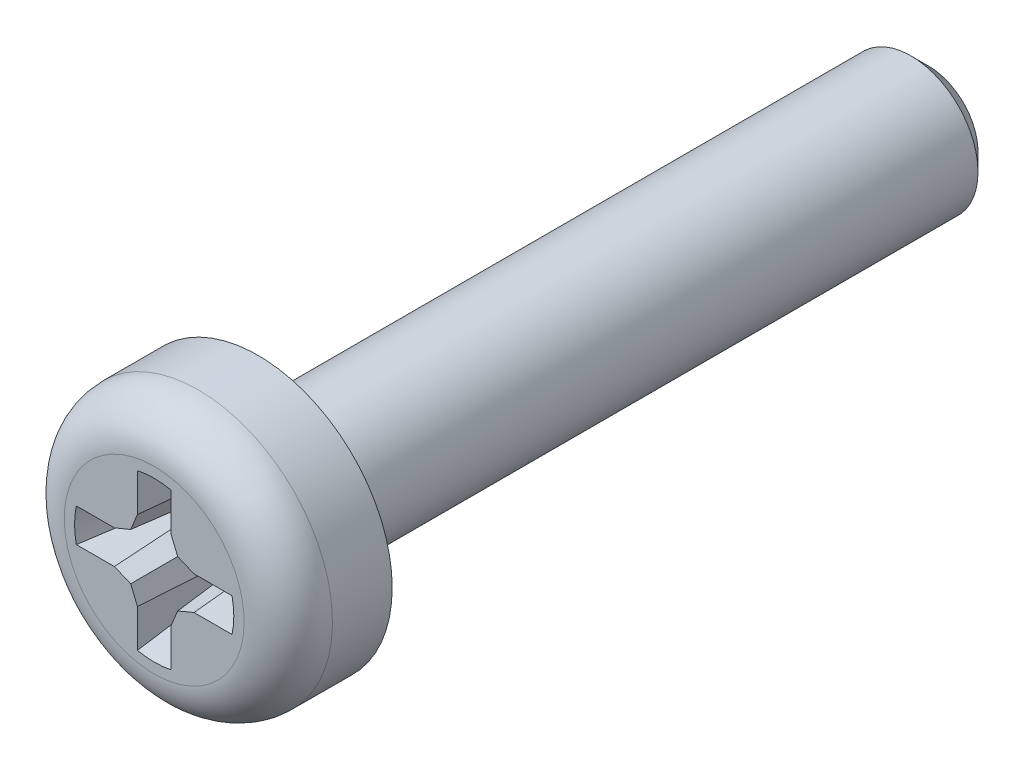
ISO-10303-21;
HEADER;
FILE_DESCRIPTION(('STEP AP214'),'2;1');
FILE_NAME('part.step','',(''),(''),'','','');
FILE_SCHEMA(('AUTOMOTIVE_DESIGN { 1 0 10303 214 1 1 1 1 }'));
ENDSEC;
DATA;
#1=APPLICATION_CONTEXT('core data for automotive mechanical design processes');
#2=APPLICATION_PROTOCOL_DEFINITION('international standard','automotive_design',2000,#1);
#3=PRODUCT_CONTEXT('',#1,'mechanical');
#4=PRODUCT('Part','Part','',(#3));
#5=PRODUCT_RELATED_PRODUCT_CATEGORY('part','',(#4));
#6=PRODUCT_DEFINITION_FORMATION('','',#4);
#7=PRODUCT_DEFINITION_CONTEXT('part definition',#1,'design');
#8=PRODUCT_DEFINITION('design','',#6,#7);
#9=PRODUCT_DEFINITION_SHAPE('','',#8);
#10=(LENGTH_UNIT() NAMED_UNIT(*) SI_UNIT(.MILLI.,.METRE.));
#11=(NAMED_UNIT(*) PLANE_ANGLE_UNIT() SI_UNIT($,.RADIAN.));
#12=(NAMED_UNIT(*) SI_UNIT($,.STERADIAN.) SOLID_ANGLE_UNIT());
#13=UNCERTAINTY_MEASURE_WITH_UNIT(LENGTH_MEASURE(1.E-05),#10,'distance_accuracy_value','');
#14=(GEOMETRIC_REPRESENTATION_CONTEXT(3) GLOBAL_UNCERTAINTY_ASSIGNED_CONTEXT((#13)) GLOBAL_UNIT_ASSIGNED_CONTEXT((#10,
#11,#12)) REPRESENTATION_CONTEXT('',''));
#15=CARTESIAN_POINT('',(0.,0.,0.));
#16=DIRECTION('',(0.,0.,1.));
#17=DIRECTION('',(1.,0.,0.));
#18=AXIS2_PLACEMENT_3D('',#15,#16,#17);
#19=CARTESIAN_POINT('',(0.,0.,0.));
#20=DIRECTION('',(0.,0.,1.));
#21=DIRECTION('',(1.,0.,0.));
#22=AXIS2_PLACEMENT_3D('',#19,#20,#21);
#23=PLANE('',#22);
#24=CARTESIAN_POINT('',(0.,0.,0.));
#25=DIRECTION('',(0.,0.,1.));
#26=DIRECTION('',(1.,0.,0.));
#27=AXIS2_PLACEMENT_3D('',#24,#25,#26);
#28=CIRCLE('',#27,4.);
#29=CARTESIAN_POINT('',(-4.,0.,0.));
#30=VERTEX_POINT('',#29);
#31=EDGE_CURVE('E56',#30,#30,#28,.T.);
#32=ORIENTED_EDGE('',*,*,#31,.F.);
#33=EDGE_LOOP('',(#32));
#34=FACE_BOUND('',#33,.T.);
#35=CARTESIAN_POINT('',(0.,0.,0.));
#36=DIRECTION('',(0.,0.,1.));
#37=DIRECTION('',(1.,0.,0.));
#38=AXIS2_PLACEMENT_3D('',#35,#36,#37);
#39=CIRCLE('',#38,2.);
#40=CARTESIAN_POINT('',(2.,0.,0.));
#41=VERTEX_POINT('',#40);
#42=EDGE_CURVE('E11',#41,#41,#39,.F.);
#43=ORIENTED_EDGE('',*,*,#42,.F.);
#44=EDGE_LOOP('',(#43));
#45=FACE_BOUND('',#44,.T.);
#46=ADVANCED_FACE('F39',(#34,#45),#23,.F.);
#47=CARTESIAN_POINT('',(0.,0.,3.1));
#48=DIRECTION('',(0.,0.,-1.));
#49=DIRECTION('',(-1.,0.,0.));
#50=AXIS2_PLACEMENT_3D('',#47,#48,#49);
#51=CYLINDRICAL_SURFACE('',#50,4.);
#52=CARTESIAN_POINT('',(0.,0.,1.7825));
#53=DIRECTION('',(0.,0.,-1.));
#54=DIRECTION('',(0.,1.,0.));
#55=AXIS2_PLACEMENT_3D('',#52,#53,#54);
#56=CIRCLE('',#55,4.);
#57=CARTESIAN_POINT('',(-4.,0.,1.7825));
#58=VERTEX_POINT('',#57);
#59=EDGE_CURVE('E456',#58,#58,#56,.T.);
#60=CARTESIAN_POINT('',(-4.,0.,1.7825));
#61=CARTESIAN_POINT('',(-4.,0.,1.76393229166667));
#62=CARTESIAN_POINT('',(-4.,0.,1.74536458333333));
#63=CARTESIAN_POINT('',(-4.,0.,1.70822916666667));
#64=CARTESIAN_POINT('',(-4.,0.,1.68966145833333));
#65=CARTESIAN_POINT('',(-4.,0.,1.65252604166667));
#66=CARTESIAN_POINT('',(-4.,0.,1.63395833333333));
#67=CARTESIAN_POINT('',(-4.,0.,1.59682291666667));
#68=CARTESIAN_POINT('',(-4.,0.,1.57825520833333));
#69=CARTESIAN_POINT('',(-4.,0.,1.54111979166667));
#70=CARTESIAN_POINT('',(-4.,0.,1.52255208333333));
#71=CARTESIAN_POINT('',(-4.,0.,1.48541666666667));
#72=CARTESIAN_POINT('',(-4.,0.,1.46684895833333));
#73=CARTESIAN_POINT('',(-4.,0.,1.42971354166667));
#74=CARTESIAN_POINT('',(-4.,0.,1.41114583333333));
#75=CARTESIAN_POINT('',(-4.,0.,1.37401041666667));
#76=CARTESIAN_POINT('',(-4.,0.,1.35544270833333));
#77=CARTESIAN_POINT('',(-4.,0.,1.31830729166667));
#78=CARTESIAN_POINT('',(-4.,0.,1.29973958333333));
#79=CARTESIAN_POINT('',(-4.,0.,1.26260416666667));
#80=CARTESIAN_POINT('',(-4.,0.,1.24403645833333));
#81=CARTESIAN_POINT('',(-4.,0.,1.20690104166667));
#82=CARTESIAN_POINT('',(-4.,0.,1.18833333333333));
#83=CARTESIAN_POINT('',(-4.,0.,1.15119791666667));
#84=CARTESIAN_POINT('',(-4.,0.,1.13263020833333));
#85=CARTESIAN_POINT('',(-4.,0.,1.09549479166667));
#86=CARTESIAN_POINT('',(-4.,0.,1.07692708333333));
#87=CARTESIAN_POINT('',(-4.,0.,1.03979166666667));
#88=CARTESIAN_POINT('',(-4.,0.,1.02122395833333));
#89=CARTESIAN_POINT('',(-4.,0.,0.984088541666667));
#90=CARTESIAN_POINT('',(-4.,0.,0.965520833333333));
#91=CARTESIAN_POINT('',(-4.,0.,0.928385416666666));
#92=CARTESIAN_POINT('',(-4.,0.,0.909817708333333));
#93=CARTESIAN_POINT('',(-4.,0.,0.872682291666666));
#94=CARTESIAN_POINT('',(-4.,0.,0.854114583333333));
#95=CARTESIAN_POINT('',(-4.,0.,0.816979166666667));
#96=CARTESIAN_POINT('',(-4.,0.,0.798411458333333));
#97=CARTESIAN_POINT('',(-4.,0.,0.761276041666667));
#98=CARTESIAN_POINT('',(-4.,0.,0.742708333333333));
#99=CARTESIAN_POINT('',(-4.,0.,0.705572916666667));
#100=CARTESIAN_POINT('',(-4.,0.,0.687005208333333));
#101=CARTESIAN_POINT('',(-4.,0.,0.649869791666667));
#102=CARTESIAN_POINT('',(-4.,0.,0.631302083333333));
#103=CARTESIAN_POINT('',(-4.,0.,0.594166666666667));
#104=CARTESIAN_POINT('',(-4.,0.,0.575598958333333));
#105=CARTESIAN_POINT('',(-4.,0.,0.538463541666667));
#106=CARTESIAN_POINT('',(-4.,0.,0.519895833333333));
#107=CARTESIAN_POINT('',(-4.,0.,0.482760416666667));
#108=CARTESIAN_POINT('',(-4.,0.,0.464192708333333));
#109=CARTESIAN_POINT('',(-4.,0.,0.427057291666667));
#110=CARTESIAN_POINT('',(-4.,0.,0.408489583333333));
#111=CARTESIAN_POINT('',(-4.,0.,0.371354166666667));
#112=CARTESIAN_POINT('',(-4.,0.,0.352786458333333));
#113=CARTESIAN_POINT('',(-4.,0.,0.315651041666667));
#114=CARTESIAN_POINT('',(-4.,0.,0.297083333333333));
#115=CARTESIAN_POINT('',(-4.,0.,0.259947916666666));
#116=CARTESIAN_POINT('',(-4.,0.,0.241380208333333));
#117=CARTESIAN_POINT('',(-4.,0.,0.204244791666667));
#118=CARTESIAN_POINT('',(-4.,0.,0.185677083333333));
#119=CARTESIAN_POINT('',(-4.,0.,0.148541666666667));
#120=CARTESIAN_POINT('',(-4.,0.,0.129973958333333));
#121=CARTESIAN_POINT('',(-4.,0.,0.0928385416666666));
#122=CARTESIAN_POINT('',(-4.,0.,0.0742708333333332));
#123=CARTESIAN_POINT('',(-4.,0.,0.0371354166666665));
#124=CARTESIAN_POINT('',(-4.,0.,0.0185677083333332));
#125=CARTESIAN_POINT('',(-4.,0.,0.));
#126=B_SPLINE_CURVE_WITH_KNOTS('',3,(#60,#61,#62,#63,#64,#65,#66,#67,#68,#69,#70,#71,#72,#73,
#74,#75,#76,#77,#78,#79,#80,#81,#82,#83,#84,#85,#86,#87,#88,#89,#90,#91,#92,#93,#94,#95,#96,#97,
#98,#99,#100,#101,#102,#103,#104,#105,#106,#107,#108,#109,#110,#111,#112,#113,#114,#115,#116,
#117,#118,#119,#120,#121,#122,#123,#124,#125),.UNSPECIFIED.,.F.,.F.,(4,2,2,2,2,2,2,2,2,2,2,2,2,
2,2,2,2,2,2,2,2,2,2,2,2,2,2,2,2,2,2,2,4),(0.,0.055703125,0.11140625,0.167109375,0.2228125,
0.278515625,0.33421875,0.389921875,0.445625,0.501328125,0.55703125,0.612734375,0.6684375,
0.724140625,0.77984375,0.835546875,0.89125,0.946953125,1.00265625,1.058359375,1.1140625,
1.169765625,1.22546875,1.281171875,1.336875,1.392578125,1.44828125,1.503984375,1.5596875,
1.615390625,1.67109375,1.726796875,1.7825),.UNSPECIFIED.);
#127=EDGE_CURVE('BSEAM382',#58,#30,#126,.T.);
#128=ORIENTED_EDGE('',*,*,#59,.T.);
#129=ORIENTED_EDGE('',*,*,#31,.T.);
#130=ORIENTED_EDGE('',*,*,#127,.T.);
#131=ORIENTED_EDGE('',*,*,#127,.F.);
#132=EDGE_LOOP('',(#128,#130,#129,#131));
#133=FACE_BOUND('',#132,.T.);
#134=ADVANCED_FACE('F382',(#133),#51,.T.);
#135=CARTESIAN_POINT('',(0.,0.,1.7825));
#136=DIRECTION('',(0.,0.,-1.));
#137=DIRECTION('',(0.,1.,0.));
#138=AXIS2_PLACEMENT_3D('',#135,#136,#137);
#139=TOROIDAL_SURFACE('',#138,2.6825,1.3175);
#140=ORIENTED_EDGE('',*,*,#59,.F.);
#141=EDGE_LOOP('',(#140));
#142=FACE_BOUND('',#141,.T.);
#143=CARTESIAN_POINT('',(0.,0.,3.1));
#144=DIRECTION('',(0.,0.,-1.));
#145=DIRECTION('',(0.,1.,0.));
#146=AXIS2_PLACEMENT_3D('',#143,#144,#145);
#147=CIRCLE('',#146,2.6825);
#148=CARTESIAN_POINT('',(0.,2.6825,3.1));
#149=VERTEX_POINT('',#148);
#150=EDGE_CURVE('E452',#149,#149,#147,.T.);
#151=ORIENTED_EDGE('',*,*,#150,.T.);
#152=EDGE_LOOP('',(#151));
#153=FACE_BOUND('',#152,.T.);
#154=ADVANCED_FACE('F388',(#142,#153),#139,.T.);
#155=CARTESIAN_POINT('',(0.,0.,3.1));
#156=DIRECTION('',(0.,0.,1.));
#157=DIRECTION('',(1.,0.,0.));
#158=AXIS2_PLACEMENT_3D('',#155,#156,#157);
#159=PLANE('',#158);
#160=DIRECTION('',(0.,-1.,0.));
#161=VECTOR('',#160,1.);
#162=CARTESIAN_POINT('',(-0.500000000000005,1.1875,3.1));
#163=LINE('',#162,#161);
#164=CARTESIAN_POINT('',(-0.500000000000009,2.32177195262584,3.1));
#165=VERTEX_POINT('',#164);
#166=CARTESIAN_POINT('',(-0.500000000000005,1.1875,3.1));
#167=VERTEX_POINT('',#166);
#168=EDGE_CURVE('E337',#165,#167,#163,.T.);
#169=ORIENTED_EDGE('',*,*,#168,.F.);
#170=CARTESIAN_POINT('',(0.,0.,3.1));
#171=DIRECTION('',(0.,0.,1.));
#172=DIRECTION('',(1.,0.,0.));
#173=AXIS2_PLACEMENT_3D('',#170,#171,#172);
#174=CIRCLE('',#173,2.375);
#175=CARTESIAN_POINT('',(0.5,2.32177195262584,3.1));
#176=VERTEX_POINT('',#175);
#177=EDGE_CURVE('E344',#176,#165,#174,.T.);
#178=ORIENTED_EDGE('',*,*,#177,.F.);
#179=DIRECTION('',(0.,1.,0.));
#180=VECTOR('',#179,1.);
#181=CARTESIAN_POINT('',(0.5,2.32177195262584,3.1));
#182=LINE('',#181,#180);
#183=CARTESIAN_POINT('',(0.5,1.1875,3.1));
#184=VERTEX_POINT('',#183);
#185=EDGE_CURVE('E440',#184,#176,#182,.T.);
#186=ORIENTED_EDGE('',*,*,#185,.F.);
#187=DIRECTION('',(-0.382683432365083,0.923879532511289,0.));
#188=VECTOR('',#187,1.);
#189=CARTESIAN_POINT('',(0.5,1.1875,3.1));
#190=LINE('',#189,#188);
#191=CARTESIAN_POINT('',(0.701364087934246,0.701364087934246,3.1));
#192=VERTEX_POINT('',#191);
#193=EDGE_CURVE('E434',#192,#184,#190,.T.);
#194=ORIENTED_EDGE('',*,*,#193,.F.);
#195=DIRECTION('',(-0.92387953251129,0.382683432365083,0.));
#196=VECTOR('',#195,1.);
#197=CARTESIAN_POINT('',(1.1875,0.500000000000001,3.1));
#198=LINE('',#197,#196);
#199=CARTESIAN_POINT('',(1.1875,0.500000000000001,3.1));
#200=VERTEX_POINT('',#199);
#201=EDGE_CURVE('E193',#200,#192,#198,.T.);
#202=ORIENTED_EDGE('',*,*,#201,.F.);
#203=DIRECTION('',(-1.,0.,0.));
#204=VECTOR('',#203,1.);
#205=CARTESIAN_POINT('',(1.1875,0.500000000000001,3.1));
#206=LINE('',#205,#204);
#207=CARTESIAN_POINT('',(2.32177195262584,0.500000000000001,3.1));
#208=VERTEX_POINT('',#207);
#209=EDGE_CURVE('E426',#208,#200,#206,.T.);
#210=ORIENTED_EDGE('',*,*,#209,.F.);
#211=CARTESIAN_POINT('',(0.,0.,3.1));
#212=DIRECTION('',(0.,0.,1.));
#213=DIRECTION('',(1.,0.,0.));
#214=AXIS2_PLACEMENT_3D('',#211,#212,#213);
#215=CIRCLE('',#214,2.375);
#216=CARTESIAN_POINT('',(2.32177195262584,-0.499999999999976,3.1));
#217=VERTEX_POINT('',#216);
#218=EDGE_CURVE('E290',#217,#208,#215,.T.);
#219=ORIENTED_EDGE('',*,*,#218,.F.);
#220=DIRECTION('',(1.,0.,0.));
#221=VECTOR('',#220,1.);
#222=CARTESIAN_POINT('',(2.32177195262584,-0.499999999999976,3.1));
#223=LINE('',#222,#221);
#224=CARTESIAN_POINT('',(1.1875,-0.499999999999988,3.1));
#225=VERTEX_POINT('',#224);
#226=EDGE_CURVE('E519',#225,#217,#223,.T.);
#227=ORIENTED_EDGE('',*,*,#226,.F.);
#228=DIRECTION('',(0.923879532511285,0.382683432365093,0.));
#229=VECTOR('',#228,1.);
#230=CARTESIAN_POINT('',(1.1875,-0.499999999999988,3.1));
#231=LINE('',#230,#229);
#232=CARTESIAN_POINT('',(0.701364087934254,-0.701364087934238,3.1));
#233=VERTEX_POINT('',#232);
#234=EDGE_CURVE('E522',#233,#225,#231,.T.);
#235=ORIENTED_EDGE('',*,*,#234,.F.);
#236=DIRECTION('',(0.382683432365073,0.923879532511294,0.));
#237=VECTOR('',#236,1.);
#238=CARTESIAN_POINT('',(0.500000000000013,-1.18749999999999,3.1));
#239=LINE('',#238,#237);
#240=CARTESIAN_POINT('',(0.500000000000013,-1.18749999999999,3.1));
#241=VERTEX_POINT('',#240);
#242=EDGE_CURVE('E525',#241,#233,#239,.T.);
#243=ORIENTED_EDGE('',*,*,#242,.F.);
#244=DIRECTION('',(0.,1.,0.));
#245=VECTOR('',#244,1.);
#246=CARTESIAN_POINT('',(0.500000000000013,-1.18749999999999,3.1));
#247=LINE('',#246,#245);
#248=CARTESIAN_POINT('',(0.500000000000025,-2.32177195262583,3.1));
#249=VERTEX_POINT('',#248);
#250=EDGE_CURVE('E528',#249,#241,#247,.T.);
#251=ORIENTED_EDGE('',*,*,#250,.F.);
#252=CARTESIAN_POINT('',(0.,0.,3.1));
#253=DIRECTION('',(0.,0.,1.));
#254=DIRECTION('',(-1.,0.,0.));
#255=AXIS2_PLACEMENT_3D('',#252,#253,#254);
#256=CIRCLE('',#255,2.375);
#257=CARTESIAN_POINT('',(-0.499999999999984,-2.32177195262584,3.1));
#258=VERTEX_POINT('',#257);
#259=EDGE_CURVE('E499',#258,#249,#256,.T.);
#260=ORIENTED_EDGE('',*,*,#259,.F.);
#261=DIRECTION('',(0.,-1.,0.));
#262=VECTOR('',#261,1.);
#263=CARTESIAN_POINT('',(-0.499999999999984,-2.32177195262584,3.1));
#264=LINE('',#263,#262);
#265=CARTESIAN_POINT('',(-0.499999999999992,-1.1875,3.1));
#266=VERTEX_POINT('',#265);
#267=EDGE_CURVE('E503',#266,#258,#264,.T.);
#268=ORIENTED_EDGE('',*,*,#267,.F.);
#269=DIRECTION('',(0.382683432365089,-0.923879532511287,0.));
#270=VECTOR('',#269,1.);
#271=CARTESIAN_POINT('',(-0.499999999999992,-1.1875,3.1));
#272=LINE('',#271,#270);
#273=CARTESIAN_POINT('',(-0.701364087934241,-0.701364087934251,3.1));
#274=VERTEX_POINT('',#273);
#275=EDGE_CURVE('E507',#274,#266,#272,.T.);
#276=ORIENTED_EDGE('',*,*,#275,.F.);
#277=DIRECTION('',(0.923879532511292,-0.382683432365076,0.));
#278=VECTOR('',#277,1.);
#279=CARTESIAN_POINT('',(-1.1875,-0.500000000000009,3.1));
#280=LINE('',#279,#278);
#281=CARTESIAN_POINT('',(-1.1875,-0.500000000000009,3.1));
#282=VERTEX_POINT('',#281);
#283=EDGE_CURVE('E511',#282,#274,#280,.T.);
#284=ORIENTED_EDGE('',*,*,#283,.F.);
#285=DIRECTION('',(1.,0.,0.));
#286=VECTOR('',#285,1.);
#287=CARTESIAN_POINT('',(-1.1875,-0.500000000000009,3.1));
#288=LINE('',#287,#286);
#289=CARTESIAN_POINT('',(-2.32177195262584,-0.500000000000017,3.1));
#290=VERTEX_POINT('',#289);
#291=EDGE_CURVE('E515',#290,#282,#288,.T.);
#292=ORIENTED_EDGE('',*,*,#291,.F.);
#293=CARTESIAN_POINT('',(0.,0.,3.1));
#294=DIRECTION('',(0.,0.,1.));
#295=DIRECTION('',(0.,1.,0.));
#296=AXIS2_PLACEMENT_3D('',#293,#294,#295);
#297=CIRCLE('',#296,2.375);
#298=CARTESIAN_POINT('',(-2.32177195262584,0.499999999999992,3.1));
#299=VERTEX_POINT('',#298);
#300=EDGE_CURVE('E138',#299,#290,#297,.T.);
#301=ORIENTED_EDGE('',*,*,#300,.F.);
#302=DIRECTION('',(-1.,0.,0.));
#303=VECTOR('',#302,1.);
#304=CARTESIAN_POINT('',(-2.32177195262584,0.499999999999992,3.1));
#305=LINE('',#304,#303);
#306=CARTESIAN_POINT('',(-1.1875,0.499999999999996,3.1));
#307=VERTEX_POINT('',#306);
#308=EDGE_CURVE('E484',#307,#299,#305,.T.);
#309=ORIENTED_EDGE('',*,*,#308,.F.);
#310=DIRECTION('',(-0.923879532511288,-0.382683432365086,0.));
#311=VECTOR('',#310,1.);
#312=CARTESIAN_POINT('',(-1.1875,0.499999999999996,3.1));
#313=LINE('',#312,#311);
#314=CARTESIAN_POINT('',(-0.701364087934249,0.701364087934243,3.1));
#315=VERTEX_POINT('',#314);
#316=EDGE_CURVE('E487',#315,#307,#313,.T.);
#317=ORIENTED_EDGE('',*,*,#316,.F.);
#318=DIRECTION('',(-0.38268343236508,-0.923879532511291,0.));
#319=VECTOR('',#318,1.);
#320=CARTESIAN_POINT('',(-0.500000000000005,1.1875,3.1));
#321=LINE('',#320,#319);
#322=EDGE_CURVE('E493',#167,#315,#321,.T.);
#323=ORIENTED_EDGE('',*,*,#322,.F.);
#324=EDGE_LOOP('',(#169,#178,#186,#194,#202,#210,#219,#227,#235,#243,#251,#260,#268,#276,#284,
#292,#301,#309,#317,#323));
#325=FACE_BOUND('',#324,.T.);
#326=ORIENTED_EDGE('',*,*,#150,.F.);
#327=EDGE_LOOP('',(#326));
#328=FACE_BOUND('',#327,.T.);
#329=ADVANCED_FACE('F393',(#325,#328),#159,.T.);
#330=CARTESIAN_POINT('',(0.,0.,-20.));
#331=DIRECTION('',(0.,0.,1.));
#332=DIRECTION('',(1.,0.,0.));
#333=AXIS2_PLACEMENT_3D('',#330,#331,#332);
#334=PLANE('',#333);
#335=CARTESIAN_POINT('',(0.,0.,-20.));
#336=DIRECTION('',(0.,0.,1.));
#337=DIRECTION('',(1.,0.,0.));
#338=AXIS2_PLACEMENT_3D('',#335,#336,#337);
#339=CIRCLE('',#338,1.475);
#340=CARTESIAN_POINT('',(1.475,0.,-20.));
#341=VERTEX_POINT('',#340);
#342=EDGE_CURVE('E448',#341,#341,#339,.F.);
#343=ORIENTED_EDGE('',*,*,#342,.T.);
#344=EDGE_LOOP('',(#343));
#345=FACE_BOUND('',#344,.T.);
#346=ADVANCED_FACE('F396',(#345),#334,.F.);
#347=CARTESIAN_POINT('',(0.,0.,0.));
#348=DIRECTION('',(0.,0.,1.));
#349=DIRECTION('',(1.,0.,0.));
#350=AXIS2_PLACEMENT_3D('',#347,#348,#349);
#351=CYLINDRICAL_SURFACE('',#350,2.);
#352=CARTESIAN_POINT('',(0.,0.,-19.475));
#353=DIRECTION('',(0.,0.,1.));
#354=DIRECTION('',(1.,0.,0.));
#355=AXIS2_PLACEMENT_3D('',#352,#353,#354);
#356=CIRCLE('',#355,2.);
#357=CARTESIAN_POINT('',(2.,0.,-19.475));
#358=VERTEX_POINT('',#357);
#359=EDGE_CURVE('E229',#358,#358,#356,.T.);
#360=ORIENTED_EDGE('',*,*,#359,.T.);
#361=EDGE_LOOP('',(#360));
#362=FACE_BOUND('',#361,.T.);
#363=ORIENTED_EDGE('',*,*,#42,.T.);
#364=EDGE_LOOP('',(#363));
#365=FACE_BOUND('',#364,.T.);
#366=ADVANCED_FACE('F403',(#362,#365),#351,.T.);
#367=CARTESIAN_POINT('',(0.,0.,-19.475));
#368=DIRECTION('',(0.,0.,1.));
#369=DIRECTION('',(1.,0.,0.));
#370=AXIS2_PLACEMENT_3D('',#367,#368,#369);
#371=CONICAL_SURFACE('',#370,2.,0.785398163397454);
#372=ORIENTED_EDGE('',*,*,#342,.F.);
#373=EDGE_LOOP('',(#372));
#374=FACE_BOUND('',#373,.T.);
#375=ORIENTED_EDGE('',*,*,#359,.F.);
#376=EDGE_LOOP('',(#375));
#377=FACE_BOUND('',#376,.T.);
#378=ADVANCED_FACE('F238',(#374,#377),#371,.T.);
#379=CARTESIAN_POINT('',(0.,0.,3.1));
#380=DIRECTION('',(0.,0.,1.));
#381=DIRECTION('',(1.,0.,0.));
#382=AXIS2_PLACEMENT_3D('',#379,#380,#381);
#383=CONICAL_SURFACE('',#382,2.375,0.26179938779915);
#384=ORIENTED_EDGE('',*,*,#177,.T.);
#385=CARTESIAN_POINT('',(-0.500000000000009,2.32177195262584,3.1));
#386=CARTESIAN_POINT('',(-0.47343930678139,2.24427703480566,2.79640988731358));
#387=CARTESIAN_POINT('',(-0.446879730252152,2.16673165946756,2.49283253844521));
#388=CARTESIAN_POINT('',(-0.393764081079549,2.01148388565445,1.88571789030724));
#389=CARTESIAN_POINT('',(-0.367208008434063,1.93378148727489,1.58218059101342));
#390=CARTESIAN_POINT('',(-0.314100594056121,1.77816343242277,0.975160067009124));
#391=CARTESIAN_POINT('',(-0.287549252325663,1.70024777586032,0.671676842321505));
#392=CARTESIAN_POINT('',(-0.234454103493325,1.54407853183752,0.0647965141449838));
#393=CARTESIAN_POINT('',(-0.207910296396182,1.46582494416517,-0.238600589289766));
#394=CARTESIAN_POINT('',(-0.181371669535779,1.38734008699268,-0.541938482347625));
#395=B_SPLINE_CURVE_WITH_KNOTS('',3,(#385,#386,#387,#388,#389,#390,#391,#392,#393,#394),
.UNSPECIFIED.,.F.,.F.,(4,2,2,2,4),(0.,0.943345660311494,1.88669074731104,2.83003623194303,
3.77338230842007),.UNSPECIFIED.);
#396=CARTESIAN_POINT('',(-0.269467371609197,1.64705627783094,0.465));
#397=VERTEX_POINT('',#396);
#398=EDGE_CURVE('E247',#397,#165,#395,.F.);
#399=ORIENTED_EDGE('',*,*,#398,.F.);
#400=CARTESIAN_POINT('',(0.,0.,0.465));
#401=DIRECTION('',(0.,0.,1.));
#402=DIRECTION('',(1.,0.,0.));
#403=AXIS2_PLACEMENT_3D('',#400,#401,#402);
#404=CIRCLE('',#403,1.66895387794399);
#405=CARTESIAN_POINT('',(0.26946737160919,1.64705627783094,0.465));
#406=VERTEX_POINT('',#405);
#407=EDGE_CURVE('E220',#406,#397,#404,.T.);
#408=ORIENTED_EDGE('',*,*,#407,.F.);
#409=CARTESIAN_POINT('',(0.26946737160919,1.64705627783094,0.465));
#410=CARTESIAN_POINT('',(0.28867325225766,1.70351500535314,0.684524220332607));
#411=CARTESIAN_POINT('',(0.307880871567887,1.75989578614274,0.904068313660021));
#412=CARTESIAN_POINT('',(0.346298880089182,1.8725328045999,1.34318816042636));
#413=CARTESIAN_POINT('',(0.3655092692997,1.9287890422922,1.56276391385898));
#414=CARTESIAN_POINT('',(0.403932116044099,2.04120834207889,2.00193906176845));
#415=CARTESIAN_POINT('',(0.423144573577789,2.09737140418194,2.2215384562431));
#416=CARTESIAN_POINT('',(0.461571147425222,2.20962295987111,2.66075620513519));
#417=CARTESIAN_POINT('',(0.480785263739293,2.26571145344256,2.88037455955635));
#418=CARTESIAN_POINT('',(0.5,2.32177195262584,3.1));
#419=B_SPLINE_CURVE_WITH_KNOTS('',3,(#409,#410,#411,#412,#413,#414,#415,#416,#417,#418),
.UNSPECIFIED.,.F.,.F.,(4,2,2,2,4),(0.,0.682441186737258,1.36488223792859,2.04732322572323,
2.72976434777311),.UNSPECIFIED.);
#420=EDGE_CURVE('E65',#406,#176,#419,.T.);
#421=ORIENTED_EDGE('',*,*,#420,.T.);
#422=EDGE_LOOP('',(#384,#399,#408,#421));
#423=FACE_BOUND('',#422,.T.);
#424=ADVANCED_FACE('F235',(#423),#383,.F.);
#425=CARTESIAN_POINT('',(0.5,2.32177195262584,3.1));
#426=DIRECTION('',(-0.996194698091746,0.,0.0871557427476584));
#427=DIRECTION('',(0.0871557427476584,0.,0.996194698091746));
#428=AXIS2_PLACEMENT_3D('',#425,#426,#427);
#429=PLANE('',#428);
#430=ORIENTED_EDGE('',*,*,#185,.T.);
#431=ORIENTED_EDGE('',*,*,#420,.F.);
#432=DIRECTION('',(0.,-1.,0.));
#433=VECTOR('',#432,1.);
#434=CARTESIAN_POINT('',(0.26946737160919,0.,0.465));
#435=LINE('',#434,#433);
#436=CARTESIAN_POINT('',(0.26946737160919,1.14164420912853,0.465));
#437=VERTEX_POINT('',#436);
#438=EDGE_CURVE('E207',#437,#406,#435,.F.);
#439=ORIENTED_EDGE('',*,*,#438,.F.);
#440=DIRECTION('',(0.0871426484044397,0.01733375049386,0.996045029063886));
#441=VECTOR('',#440,1.);
#442=CARTESIAN_POINT('',(0.501713327907611,1.1878408021102,3.11958342759577));
#443=LINE('',#442,#441);
#444=EDGE_CURVE('E198',#437,#184,#443,.T.);
#445=ORIENTED_EDGE('',*,*,#444,.T.);
#446=EDGE_LOOP('',(#430,#431,#439,#445));
#447=FACE_BOUND('',#446,.T.);
#448=ADVANCED_FACE('F231',(#447),#429,.T.);
#449=CARTESIAN_POINT('',(0.5,1.1875,3.1));
#450=DIRECTION('',(-0.920363891963227,-0.381227206369647,0.0871557427476584));
#451=DIRECTION('',(0.382683432365083,-0.92387953251129,0.));
#452=AXIS2_PLACEMENT_3D('',#449,#450,#451);
#453=PLANE('',#452);
#454=ORIENTED_EDGE('',*,*,#193,.T.);
#455=ORIENTED_EDGE('',*,*,#444,.F.);
#456=DIRECTION('',(0.382683432365083,-0.92387953251129,0.));
#457=VECTOR('',#456,1.);
#458=CARTESIAN_POINT('',(0.633636969679846,0.262461026462376,0.465));
#459=LINE('',#458,#457);
#460=CARTESIAN_POINT('',(0.524922052924763,0.524922052924764,0.465));
#461=VERTEX_POINT('',#460);
#462=EDGE_CURVE('E202',#461,#437,#459,.F.);
#463=ORIENTED_EDGE('',*,*,#462,.F.);
#464=DIRECTION('',(0.0666626913468326,0.0666626913468325,0.995546167269401));
#465=VECTOR('',#464,1.);
#466=CARTESIAN_POINT('',(0.702629589549231,0.702629589549231,3.11889910618695));
#467=LINE('',#466,#465);
#468=EDGE_CURVE('E186',#461,#192,#467,.T.);
#469=ORIENTED_EDGE('',*,*,#468,.T.);
#470=EDGE_LOOP('',(#454,#455,#463,#469));
#471=FACE_BOUND('',#470,.T.);
#472=ADVANCED_FACE('F203',(#471),#453,.T.);
#473=CARTESIAN_POINT('',(1.1875,0.500000000000001,3.1));
#474=DIRECTION('',(-0.381227206369647,-0.920363891963227,0.0871557427476584));
#475=DIRECTION('',(0.92387953251129,-0.382683432365083,0.));
#476=AXIS2_PLACEMENT_3D('',#473,#474,#475);
#477=PLANE('',#476);
#478=ORIENTED_EDGE('',*,*,#201,.T.);
#479=ORIENTED_EDGE('',*,*,#468,.F.);
#480=DIRECTION('',(0.92387953251129,-0.382683432365083,0.));
#481=VECTOR('',#480,1.);
#482=CARTESIAN_POINT('',(0.262461026462376,0.633636969679846,0.465));
#483=LINE('',#482,#481);
#484=CARTESIAN_POINT('',(1.14164420912853,0.269467371609191,0.465));
#485=VERTEX_POINT('',#484);
#486=EDGE_CURVE('E190',#485,#461,#483,.F.);
#487=ORIENTED_EDGE('',*,*,#486,.F.);
#488=DIRECTION('',(0.0173337504938599,0.0871426484044397,0.996045029063886));
#489=VECTOR('',#488,1.);
#490=CARTESIAN_POINT('',(1.1875,0.500000000000001,3.1));
#491=LINE('',#490,#489);
#492=EDGE_CURVE('E199',#485,#200,#491,.T.);
#493=ORIENTED_EDGE('',*,*,#492,.T.);
#494=EDGE_LOOP('',(#478,#479,#487,#493));
#495=FACE_BOUND('',#494,.T.);
#496=ADVANCED_FACE('F188',(#495),#477,.T.);
#497=CARTESIAN_POINT('',(1.1875,0.500000000000001,3.1));
#498=DIRECTION('',(0.,-0.996194698091746,0.0871557427476584));
#499=DIRECTION('',(0.,-0.0871557427476584,-0.996194698091746));
#500=AXIS2_PLACEMENT_3D('',#497,#498,#499);
#501=PLANE('',#500);
#502=ORIENTED_EDGE('',*,*,#209,.T.);
#503=ORIENTED_EDGE('',*,*,#492,.F.);
#504=DIRECTION('',(1.,0.,0.));
#505=VECTOR('',#504,1.);
#506=CARTESIAN_POINT('',(0.,0.269467371609191,0.465));
#507=LINE('',#506,#505);
#508=CARTESIAN_POINT('',(1.64705627783094,0.269467371609191,0.465));
#509=VERTEX_POINT('',#508);
#510=EDGE_CURVE('E211',#509,#485,#507,.F.);
#511=ORIENTED_EDGE('',*,*,#510,.F.);
#512=CARTESIAN_POINT('',(2.32177195262584,0.500000000000001,3.1));
#513=CARTESIAN_POINT('',(2.24427703480566,0.473439306781382,2.79640988731358));
#514=CARTESIAN_POINT('',(2.16673165946756,0.446879730252145,2.49283253844521));
#515=CARTESIAN_POINT('',(2.01148388565445,0.393764081079542,1.88571789030724));
#516=CARTESIAN_POINT('',(1.93378148727489,0.367208008434057,1.58218059101342));
#517=CARTESIAN_POINT('',(1.77816343242277,0.314100594056115,0.975160067009124));
#518=CARTESIAN_POINT('',(1.70024777586033,0.287549252325657,0.671676842321504));
#519=CARTESIAN_POINT('',(1.54407853183752,0.234454103493319,0.0647965141449839));
#520=CARTESIAN_POINT('',(1.46582494416517,0.207910296396176,-0.238600589289766));
#521=CARTESIAN_POINT('',(1.38734008699268,0.181371669535775,-0.541938482347625));
#522=B_SPLINE_CURVE_WITH_KNOTS('',3,(#512,#513,#514,#515,#516,#517,#518,#519,#520,#521),
.UNSPECIFIED.,.F.,.F.,(4,2,2,2,4),(0.,0.943345660311494,1.88669074731104,2.83003623194303,
3.77338230842007),.UNSPECIFIED.);
#523=EDGE_CURVE('E422',#509,#208,#522,.F.);
#524=ORIENTED_EDGE('',*,*,#523,.T.);
#525=EDGE_LOOP('',(#502,#503,#511,#524));
#526=FACE_BOUND('',#525,.T.);
#527=ADVANCED_FACE('F243',(#526),#501,.T.);
#528=CARTESIAN_POINT('',(0.,0.,3.1));
#529=DIRECTION('',(0.,0.,1.));
#530=DIRECTION('',(1.,0.,0.));
#531=AXIS2_PLACEMENT_3D('',#528,#529,#530);
#532=CONICAL_SURFACE('',#531,2.375,0.26179938779915);
#533=ORIENTED_EDGE('',*,*,#218,.T.);
#534=ORIENTED_EDGE('',*,*,#523,.F.);
#535=CARTESIAN_POINT('',(0.,0.,0.465));
#536=DIRECTION('',(0.,0.,1.));
#537=DIRECTION('',(1.,0.,0.));
#538=AXIS2_PLACEMENT_3D('',#535,#536,#537);
#539=CIRCLE('',#538,1.66895387794399);
#540=CARTESIAN_POINT('',(1.64705627783094,-0.269467371609173,0.465));
#541=VERTEX_POINT('',#540);
#542=EDGE_CURVE('E129',#541,#509,#539,.T.);
#543=ORIENTED_EDGE('',*,*,#542,.F.);
#544=CARTESIAN_POINT('',(1.64705627783094,-0.269467371609173,0.465));
#545=CARTESIAN_POINT('',(1.70351500535315,-0.288673252257643,0.684524220332607));
#546=CARTESIAN_POINT('',(1.75989578614274,-0.307880871567868,0.904068313660021));
#547=CARTESIAN_POINT('',(1.8725328045999,-0.346298880089162,1.34318816042636));
#548=CARTESIAN_POINT('',(1.9287890422922,-0.36550926929968,1.56276391385898));
#549=CARTESIAN_POINT('',(2.04120834207889,-0.403932116044078,2.00193906176845));
#550=CARTESIAN_POINT('',(2.09737140418194,-0.423144573577767,2.2215384562431));
#551=CARTESIAN_POINT('',(2.20962295987111,-0.461571147425199,2.66075620513519));
#552=CARTESIAN_POINT('',(2.26571145344256,-0.480785263739269,2.88037455955635));
#553=CARTESIAN_POINT('',(2.32177195262584,-0.499999999999976,3.1));
#554=B_SPLINE_CURVE_WITH_KNOTS('',3,(#544,#545,#546,#547,#548,#549,#550,#551,#552,#553),
.UNSPECIFIED.,.F.,.F.,(4,2,2,2,4),(0.,0.682441186737258,1.36488223792859,2.04732322572323,
2.72976434777311),.UNSPECIFIED.);
#555=EDGE_CURVE('E43',#541,#217,#554,.T.);
#556=ORIENTED_EDGE('',*,*,#555,.T.);
#557=EDGE_LOOP('',(#533,#534,#543,#556));
#558=FACE_BOUND('',#557,.T.);
#559=ADVANCED_FACE('F240',(#558),#532,.F.);
#560=CARTESIAN_POINT('',(0.,0.,0.465));
#561=DIRECTION('',(0.,0.,1.));
#562=DIRECTION('',(1.,0.,0.));
#563=AXIS2_PLACEMENT_3D('',#560,#561,#562);
#564=PLANE('',#563);
#565=ORIENTED_EDGE('',*,*,#407,.T.);
#566=DIRECTION('',(0.,1.,0.));
#567=VECTOR('',#566,1.);
#568=CARTESIAN_POINT('',(-0.269467371609191,0.,0.465));
#569=LINE('',#568,#567);
#570=CARTESIAN_POINT('',(-0.269467371609195,1.14164420912853,0.465));
#571=VERTEX_POINT('',#570);
#572=EDGE_CURVE('E261',#397,#571,#569,.F.);
#573=ORIENTED_EDGE('',*,*,#572,.T.);
#574=DIRECTION('',(0.38268343236508,0.923879532511291,0.));
#575=VECTOR('',#574,1.);
#576=CARTESIAN_POINT('',(-0.633636969679847,0.262461026462374,0.465));
#577=LINE('',#576,#575);
#578=CARTESIAN_POINT('',(-0.524922052924765,0.524922052924761,0.465));
#579=VERTEX_POINT('',#578);
#580=EDGE_CURVE('E480',#571,#579,#577,.F.);
#581=ORIENTED_EDGE('',*,*,#580,.T.);
#582=DIRECTION('',(0.923879532511288,0.382683432365086,0.));
#583=VECTOR('',#582,1.);
#584=CARTESIAN_POINT('',(-0.262461026462378,0.633636969679845,0.465));
#585=LINE('',#584,#583);
#586=CARTESIAN_POINT('',(-1.14164420912853,0.269467371609186,0.465));
#587=VERTEX_POINT('',#586);
#588=EDGE_CURVE('E483',#579,#587,#585,.F.);
#589=ORIENTED_EDGE('',*,*,#588,.T.);
#590=DIRECTION('',(1.,0.,0.));
#591=VECTOR('',#590,1.);
#592=CARTESIAN_POINT('',(0.,0.26946737160919,0.465));
#593=LINE('',#592,#591);
#594=CARTESIAN_POINT('',(-1.64705627783094,0.269467371609184,0.465));
#595=VERTEX_POINT('',#594);
#596=EDGE_CURVE('E291',#587,#595,#593,.F.);
#597=ORIENTED_EDGE('',*,*,#596,.T.);
#598=CARTESIAN_POINT('',(0.,0.,0.465));
#599=DIRECTION('',(0.,0.,1.));
#600=DIRECTION('',(1.,0.,0.));
#601=AXIS2_PLACEMENT_3D('',#598,#599,#600);
#602=CIRCLE('',#601,1.66895387794399);
#603=CARTESIAN_POINT('',(-1.64705627783094,-0.269467371609202,0.465));
#604=VERTEX_POINT('',#603);
#605=EDGE_CURVE('E258',#595,#604,#602,.T.);
#606=ORIENTED_EDGE('',*,*,#605,.T.);
#607=DIRECTION('',(-1.,0.,0.));
#608=VECTOR('',#607,1.);
#609=CARTESIAN_POINT('',(0.,-0.269467371609191,0.465));
#610=LINE('',#609,#608);
#611=CARTESIAN_POINT('',(-1.14164420912853,-0.269467371609199,0.465));
#612=VERTEX_POINT('',#611);
#613=EDGE_CURVE('E312',#604,#612,#610,.F.);
#614=ORIENTED_EDGE('',*,*,#613,.T.);
#615=DIRECTION('',(-0.923879532511292,0.382683432365076,0.));
#616=VECTOR('',#615,1.);
#617=CARTESIAN_POINT('',(-0.262461026462372,-0.633636969679848,0.465));
#618=LINE('',#617,#616);
#619=CARTESIAN_POINT('',(-0.52492205292476,-0.524922052924767,0.465));
#620=VERTEX_POINT('',#619);
#621=EDGE_CURVE('E766',#612,#620,#618,.F.);
#622=ORIENTED_EDGE('',*,*,#621,.T.);
#623=DIRECTION('',(-0.38268343236509,0.923879532511287,0.));
#624=VECTOR('',#623,1.);
#625=CARTESIAN_POINT('',(-0.633636969679844,-0.262461026462381,0.465));
#626=LINE('',#625,#624);
#627=CARTESIAN_POINT('',(-0.269467371609182,-1.14164420912853,0.465));
#628=VERTEX_POINT('',#627);
#629=EDGE_CURVE('E557',#620,#628,#626,.F.);
#630=ORIENTED_EDGE('',*,*,#629,.T.);
#631=DIRECTION('',(0.,1.,0.));
#632=VECTOR('',#631,1.);
#633=CARTESIAN_POINT('',(-0.26946737160919,0.,0.465));
#634=LINE('',#633,#632);
#635=CARTESIAN_POINT('',(-0.269467371609179,-1.64705627783094,0.465));
#636=VERTEX_POINT('',#635);
#637=EDGE_CURVE('E338',#628,#636,#634,.F.);
#638=ORIENTED_EDGE('',*,*,#637,.T.);
#639=CARTESIAN_POINT('',(0.,0.,0.465));
#640=DIRECTION('',(0.,0.,1.));
#641=DIRECTION('',(1.,0.,0.));
#642=AXIS2_PLACEMENT_3D('',#639,#640,#641);
#643=CIRCLE('',#642,1.66895387794399);
#644=CARTESIAN_POINT('',(0.269467371609208,-1.64705627783094,0.465));
#645=VERTEX_POINT('',#644);
#646=EDGE_CURVE('E309',#636,#645,#643,.T.);
#647=ORIENTED_EDGE('',*,*,#646,.T.);
#648=DIRECTION('',(0.,-1.,0.));
#649=VECTOR('',#648,1.);
#650=CARTESIAN_POINT('',(0.269467371609191,0.,0.465));
#651=LINE('',#650,#649);
#652=CARTESIAN_POINT('',(0.269467371609203,-1.14164420912853,0.465));
#653=VERTEX_POINT('',#652);
#654=EDGE_CURVE('E365',#645,#653,#651,.F.);
#655=ORIENTED_EDGE('',*,*,#654,.T.);
#656=DIRECTION('',(-0.382683432365073,-0.923879532511294,0.));
#657=VECTOR('',#656,1.);
#658=CARTESIAN_POINT('',(0.633636969679849,-0.26246102646237,0.465));
#659=LINE('',#658,#657);
#660=CARTESIAN_POINT('',(0.524922052924769,-0.524922052924757,0.465));
#661=VERTEX_POINT('',#660);
#662=EDGE_CURVE('E774',#653,#661,#659,.F.);
#663=ORIENTED_EDGE('',*,*,#662,.T.);
#664=DIRECTION('',(-0.923879532511286,-0.382683432365093,0.));
#665=VECTOR('',#664,1.);
#666=CARTESIAN_POINT('',(0.262461026462383,-0.633636969679843,0.465));
#667=LINE('',#666,#665);
#668=CARTESIAN_POINT('',(1.14164420912853,-0.269467371609178,0.465));
#669=VERTEX_POINT('',#668);
#670=EDGE_CURVE('E777',#661,#669,#667,.F.);
#671=ORIENTED_EDGE('',*,*,#670,.T.);
#672=DIRECTION('',(-1.,0.,0.));
#673=VECTOR('',#672,1.);
#674=CARTESIAN_POINT('',(0.,-0.269467371609191,0.465));
#675=LINE('',#674,#673);
#676=EDGE_CURVE('E364',#669,#541,#675,.F.);
#677=ORIENTED_EDGE('',*,*,#676,.T.);
#678=ORIENTED_EDGE('',*,*,#542,.T.);
#679=ORIENTED_EDGE('',*,*,#510,.T.);
#680=ORIENTED_EDGE('',*,*,#486,.T.);
#681=ORIENTED_EDGE('',*,*,#462,.T.);
#682=ORIENTED_EDGE('',*,*,#438,.T.);
#683=EDGE_LOOP('',(#565,#573,#581,#589,#597,#606,#614,#622,#630,#638,#647,#655,#663,#671,#677,
#678,#679,#680,#681,#682));
#684=FACE_BOUND('',#683,.T.);
#685=ADVANCED_FACE('F209',(#684),#564,.T.);
#686=CARTESIAN_POINT('',(0.,0.,3.1));
#687=DIRECTION('',(0.,0.,1.));
#688=DIRECTION('',(0.,1.,0.));
#689=AXIS2_PLACEMENT_3D('',#686,#687,#688);
#690=CONICAL_SURFACE('',#689,2.375,0.26179938779915);
#691=ORIENTED_EDGE('',*,*,#300,.T.);
#692=CARTESIAN_POINT('',(-2.32177195262584,-0.500000000000017,3.1));
#693=CARTESIAN_POINT('',(-2.24427703480566,-0.473439306781397,2.79640988731358));
#694=CARTESIAN_POINT('',(-2.16673165946756,-0.44687973025216,2.49283253844521));
#695=CARTESIAN_POINT('',(-2.01148388565444,-0.393764081079556,1.88571789030724));
#696=CARTESIAN_POINT('',(-1.93378148727489,-0.36720800843407,1.58218059101342));
#697=CARTESIAN_POINT('',(-1.77816343242277,-0.314100594056127,0.975160067009124));
#698=CARTESIAN_POINT('',(-1.70024777586032,-0.287549252325669,0.671676842321504));
#699=CARTESIAN_POINT('',(-1.54407853183752,-0.23445410349333,0.064796514144984));
#700=CARTESIAN_POINT('',(-1.46582494416517,-0.207910296396187,-0.238600589289766));
#701=CARTESIAN_POINT('',(-1.38734008699268,-0.181371669535784,-0.541938482347625));
#702=B_SPLINE_CURVE_WITH_KNOTS('',3,(#692,#693,#694,#695,#696,#697,#698,#699,#700,#701),
.UNSPECIFIED.,.F.,.F.,(4,2,2,2,4),(0.,0.943345660311494,1.88669074731104,2.83003623194303,
3.77338230842007),.UNSPECIFIED.);
#703=EDGE_CURVE('E299',#604,#290,#702,.F.);
#704=ORIENTED_EDGE('',*,*,#703,.F.);
#705=ORIENTED_EDGE('',*,*,#605,.F.);
#706=CARTESIAN_POINT('',(-1.64705627783094,0.269467371609184,0.465));
#707=CARTESIAN_POINT('',(-1.70351500535314,0.288673252257654,0.684524220332607));
#708=CARTESIAN_POINT('',(-1.75989578614274,0.30788087156788,0.904068313660021));
#709=CARTESIAN_POINT('',(-1.8725328045999,0.346298880089175,1.34318816042636));
#710=CARTESIAN_POINT('',(-1.9287890422922,0.365509269299693,1.56276391385898));
#711=CARTESIAN_POINT('',(-2.04120834207889,0.403932116044092,2.00193906176845));
#712=CARTESIAN_POINT('',(-2.09737140418194,0.423144573577781,2.2215384562431));
#713=CARTESIAN_POINT('',(-2.20962295987111,0.461571147425215,2.66075620513519));
#714=CARTESIAN_POINT('',(-2.26571145344256,0.480785263739285,2.88037455955635));
#715=CARTESIAN_POINT('',(-2.32177195262584,0.499999999999992,3.1));
#716=B_SPLINE_CURVE_WITH_KNOTS('',3,(#706,#707,#708,#709,#710,#711,#712,#713,#714,#715),
.UNSPECIFIED.,.F.,.F.,(4,2,2,2,4),(0.,0.682441186737258,1.36488223792859,2.04732322572323,
2.72976434777311),.UNSPECIFIED.);
#717=EDGE_CURVE('E282',#595,#299,#716,.T.);
#718=ORIENTED_EDGE('',*,*,#717,.T.);
#719=EDGE_LOOP('',(#691,#704,#705,#718));
#720=FACE_BOUND('',#719,.T.);
#721=ADVANCED_FACE('F278',(#720),#690,.F.);
#722=CARTESIAN_POINT('',(-2.32177195262584,0.499999999999992,3.1));
#723=DIRECTION('',(0.,-0.996194698091746,0.0871557427476584));
#724=DIRECTION('',(0.,-0.0871557427476584,-0.996194698091746));
#725=AXIS2_PLACEMENT_3D('',#722,#723,#724);
#726=PLANE('',#725);
#727=ORIENTED_EDGE('',*,*,#308,.T.);
#728=ORIENTED_EDGE('',*,*,#717,.F.);
#729=ORIENTED_EDGE('',*,*,#596,.F.);
#730=DIRECTION('',(-0.0173337504938603,0.0871426484044396,0.996045029063886));
#731=VECTOR('',#730,1.);
#732=CARTESIAN_POINT('',(-1.1878408021102,0.501713327907607,3.11958342759577));
#733=LINE('',#732,#731);
#734=EDGE_CURVE('E259',#587,#307,#733,.T.);
#735=ORIENTED_EDGE('',*,*,#734,.T.);
#736=EDGE_LOOP('',(#727,#728,#729,#735));
#737=FACE_BOUND('',#736,.T.);
#738=ADVANCED_FACE('F273',(#737),#726,.T.);
#739=CARTESIAN_POINT('',(-1.1875,0.499999999999996,3.1));
#740=DIRECTION('',(0.38122720636965,-0.920363891963226,0.0871557427476584));
#741=DIRECTION('',(0.923879532511288,0.382683432365086,0.));
#742=AXIS2_PLACEMENT_3D('',#739,#740,#741);
#743=PLANE('',#742);
#744=ORIENTED_EDGE('',*,*,#316,.T.);
#745=ORIENTED_EDGE('',*,*,#734,.F.);
#746=ORIENTED_EDGE('',*,*,#588,.F.);
#747=DIRECTION('',(-0.0666626913468328,0.0666626913468323,0.995546167269401));
#748=VECTOR('',#747,1.);
#749=CARTESIAN_POINT('',(-0.702629589549234,0.702629589549228,3.11889910618695));
#750=LINE('',#749,#748);
#751=EDGE_CURVE('E576',#579,#315,#750,.T.);
#752=ORIENTED_EDGE('',*,*,#751,.T.);
#753=EDGE_LOOP('',(#744,#745,#746,#752));
#754=FACE_BOUND('',#753,.T.);
#755=ADVANCED_FACE('F277',(#754),#743,.T.);
#756=CARTESIAN_POINT('',(-0.500000000000005,1.1875,3.1));
#757=DIRECTION('',(0.920363891963229,-0.381227206369643,0.0871557427476584));
#758=DIRECTION('',(0.38268343236508,0.923879532511291,0.));
#759=AXIS2_PLACEMENT_3D('',#756,#757,#758);
#760=PLANE('',#759);
#761=ORIENTED_EDGE('',*,*,#322,.T.);
#762=ORIENTED_EDGE('',*,*,#751,.F.);
#763=ORIENTED_EDGE('',*,*,#580,.F.);
#764=DIRECTION('',(-0.0871426484044397,0.0173337504938596,0.996045029063886));
#765=VECTOR('',#764,1.);
#766=CARTESIAN_POINT('',(-0.500000000000005,1.1875,3.1));
#767=LINE('',#766,#765);
#768=EDGE_CURVE('E257',#571,#167,#767,.T.);
#769=ORIENTED_EDGE('',*,*,#768,.T.);
#770=EDGE_LOOP('',(#761,#762,#763,#769));
#771=FACE_BOUND('',#770,.T.);
#772=ADVANCED_FACE('F269',(#771),#760,.T.);
#773=CARTESIAN_POINT('',(-0.500000000000005,1.1875,3.1));
#774=DIRECTION('',(0.996194698091746,0.,0.0871557427476584));
#775=DIRECTION('',(0.0871557427476584,0.,-0.996194698091746));
#776=AXIS2_PLACEMENT_3D('',#773,#774,#775);
#777=PLANE('',#776);
#778=ORIENTED_EDGE('',*,*,#168,.T.);
#779=ORIENTED_EDGE('',*,*,#768,.F.);
#780=ORIENTED_EDGE('',*,*,#572,.F.);
#781=ORIENTED_EDGE('',*,*,#398,.T.);
#782=EDGE_LOOP('',(#778,#779,#780,#781));
#783=FACE_BOUND('',#782,.T.);
#784=ADVANCED_FACE('F263',(#783),#777,.T.);
#785=CARTESIAN_POINT('',(0.,0.,3.1));
#786=DIRECTION('',(0.,0.,1.));
#787=DIRECTION('',(-1.,0.,0.));
#788=AXIS2_PLACEMENT_3D('',#785,#786,#787);
#789=CONICAL_SURFACE('',#788,2.375,0.26179938779915);
#790=ORIENTED_EDGE('',*,*,#259,.T.);
#791=CARTESIAN_POINT('',(0.500000000000025,-2.32177195262583,3.1));
#792=CARTESIAN_POINT('',(0.473439306781405,-2.24427703480566,2.79640988731358));
#793=CARTESIAN_POINT('',(0.446879730252167,-2.16673165946756,2.49283253844521));
#794=CARTESIAN_POINT('',(0.393764081079563,-2.01148388565444,1.88571789030724));
#795=CARTESIAN_POINT('',(0.367208008434077,-1.93378148727489,1.58218059101342));
#796=CARTESIAN_POINT('',(0.314100594056134,-1.77816343242277,0.975160067009124));
#797=CARTESIAN_POINT('',(0.287549252325675,-1.70024777586032,0.671676842321504));
#798=CARTESIAN_POINT('',(0.234454103493336,-1.54407853183752,0.064796514144984));
#799=CARTESIAN_POINT('',(0.207910296396192,-1.46582494416517,-0.238600589289766));
#800=CARTESIAN_POINT('',(0.181371669535789,-1.38734008699268,-0.541938482347625));
#801=B_SPLINE_CURVE_WITH_KNOTS('',3,(#791,#792,#793,#794,#795,#796,#797,#798,#799,#800),
.UNSPECIFIED.,.F.,.F.,(4,2,2,2,4),(0.,0.943345660311494,1.88669074731104,2.83003623194303,
3.77338230842007),.UNSPECIFIED.);
#802=EDGE_CURVE('E350',#645,#249,#801,.F.);
#803=ORIENTED_EDGE('',*,*,#802,.F.);
#804=ORIENTED_EDGE('',*,*,#646,.F.);
#805=CARTESIAN_POINT('',(-0.269467371609179,-1.64705627783094,0.465));
#806=CARTESIAN_POINT('',(-0.288673252257648,-1.70351500535314,0.684524220332607));
#807=CARTESIAN_POINT('',(-0.307880871567874,-1.75989578614274,0.904068313660021));
#808=CARTESIAN_POINT('',(-0.346298880089169,-1.8725328045999,1.34318816042636));
#809=CARTESIAN_POINT('',(-0.365509269299686,-1.9287890422922,1.56276391385898));
#810=CARTESIAN_POINT('',(-0.403932116044085,-2.04120834207889,2.00193906176845));
#811=CARTESIAN_POINT('',(-0.423144573577774,-2.09737140418194,2.2215384562431));
#812=CARTESIAN_POINT('',(-0.461571147425207,-2.20962295987111,2.66075620513518));
#813=CARTESIAN_POINT('',(-0.480785263739277,-2.26571145344256,2.88037455955635));
#814=CARTESIAN_POINT('',(-0.499999999999984,-2.32177195262584,3.1));
#815=B_SPLINE_CURVE_WITH_KNOTS('',3,(#805,#806,#807,#808,#809,#810,#811,#812,#813,#814),
.UNSPECIFIED.,.F.,.F.,(4,2,2,2,4),(0.,0.682441186737258,1.36488223792859,2.04732322572323,
2.72976434777311),.UNSPECIFIED.);
#816=EDGE_CURVE('E329',#636,#258,#815,.T.);
#817=ORIENTED_EDGE('',*,*,#816,.T.);
#818=EDGE_LOOP('',(#790,#803,#804,#817));
#819=FACE_BOUND('',#818,.T.);
#820=ADVANCED_FACE('F268',(#819),#789,.F.);
#821=CARTESIAN_POINT('',(-0.499999999999984,-2.32177195262584,3.1));
#822=DIRECTION('',(0.996194698091746,0.,0.0871557427476584));
#823=DIRECTION('',(0.0871557427476584,0.,-0.996194698091746));
#824=AXIS2_PLACEMENT_3D('',#821,#822,#823);
#825=PLANE('',#824);
#826=ORIENTED_EDGE('',*,*,#267,.T.);
#827=ORIENTED_EDGE('',*,*,#816,.F.);
#828=ORIENTED_EDGE('',*,*,#637,.F.);
#829=DIRECTION('',(-0.0871426484044396,-0.0173337504938606,0.996045029063886));
#830=VECTOR('',#829,1.);
#831=CARTESIAN_POINT('',(-0.501713327907603,-1.1878408021102,3.11958342759577));
#832=LINE('',#831,#830);
#833=EDGE_CURVE('E310',#628,#266,#832,.T.);
#834=ORIENTED_EDGE('',*,*,#833,.T.);
#835=EDGE_LOOP('',(#826,#827,#828,#834));
#836=FACE_BOUND('',#835,.T.);
#837=ADVANCED_FACE('F321',(#836),#825,.T.);
#838=CARTESIAN_POINT('',(-0.499999999999992,-1.1875,3.1));
#839=DIRECTION('',(0.920363891963224,0.381227206369653,0.0871557427476584));
#840=DIRECTION('',(-0.38268343236509,0.923879532511287,0.));
#841=AXIS2_PLACEMENT_3D('',#838,#839,#840);
#842=PLANE('',#841);
#843=ORIENTED_EDGE('',*,*,#275,.T.);
#844=ORIENTED_EDGE('',*,*,#833,.F.);
#845=ORIENTED_EDGE('',*,*,#629,.F.);
#846=DIRECTION('',(-0.0666626913468321,-0.066662691346833,0.995546167269401));
#847=VECTOR('',#846,1.);
#848=CARTESIAN_POINT('',(-0.702629589549226,-0.702629589549236,3.11889910618695));
#849=LINE('',#848,#847);
#850=EDGE_CURVE('E556',#620,#274,#849,.T.);
#851=ORIENTED_EDGE('',*,*,#850,.T.);
#852=EDGE_LOOP('',(#843,#844,#845,#851));
#853=FACE_BOUND('',#852,.T.);
#854=ADVANCED_FACE('F325',(#853),#842,.T.);
#855=CARTESIAN_POINT('',(-1.1875,-0.500000000000009,3.1));
#856=DIRECTION('',(0.38122720636964,0.92036389196323,0.0871557427476584));
#857=DIRECTION('',(-0.923879532511292,0.382683432365076,0.));
#858=AXIS2_PLACEMENT_3D('',#855,#856,#857);
#859=PLANE('',#858);
#860=ORIENTED_EDGE('',*,*,#283,.T.);
#861=ORIENTED_EDGE('',*,*,#850,.F.);
#862=ORIENTED_EDGE('',*,*,#621,.F.);
#863=DIRECTION('',(-0.0173337504938593,-0.0871426484044398,0.996045029063886));
#864=VECTOR('',#863,1.);
#865=CARTESIAN_POINT('',(-1.1875,-0.500000000000009,3.1));
#866=LINE('',#865,#864);
#867=EDGE_CURVE('E308',#612,#282,#866,.T.);
#868=ORIENTED_EDGE('',*,*,#867,.T.);
#869=EDGE_LOOP('',(#860,#861,#862,#868));
#870=FACE_BOUND('',#869,.T.);
#871=ADVANCED_FACE('F319',(#870),#859,.T.);
#872=CARTESIAN_POINT('',(-1.1875,-0.500000000000009,3.1));
#873=DIRECTION('',(0.,0.996194698091746,0.0871557427476584));
#874=DIRECTION('',(0.,-0.0871557427476584,0.996194698091746));
#875=AXIS2_PLACEMENT_3D('',#872,#873,#874);
#876=PLANE('',#875);
#877=ORIENTED_EDGE('',*,*,#291,.T.);
#878=ORIENTED_EDGE('',*,*,#867,.F.);
#879=ORIENTED_EDGE('',*,*,#613,.F.);
#880=ORIENTED_EDGE('',*,*,#703,.T.);
#881=EDGE_LOOP('',(#877,#878,#879,#880));
#882=FACE_BOUND('',#881,.T.);
#883=ADVANCED_FACE('F314',(#882),#876,.T.);
#884=CARTESIAN_POINT('',(2.32177195262584,-0.499999999999976,3.1));
#885=DIRECTION('',(0.,0.996194698091746,0.0871557427476584));
#886=DIRECTION('',(0.,-0.0871557427476584,0.996194698091746));
#887=AXIS2_PLACEMENT_3D('',#884,#885,#886);
#888=PLANE('',#887);
#889=ORIENTED_EDGE('',*,*,#226,.T.);
#890=ORIENTED_EDGE('',*,*,#555,.F.);
#891=ORIENTED_EDGE('',*,*,#676,.F.);
#892=DIRECTION('',(0.0173337504938609,-0.0871426484044395,0.996045029063886));
#893=VECTOR('',#892,1.);
#894=CARTESIAN_POINT('',(1.1878408021102,-0.501713327907599,3.11958342759577));
#895=LINE('',#894,#893);
#896=EDGE_CURVE('E121',#669,#225,#895,.T.);
#897=ORIENTED_EDGE('',*,*,#896,.T.);
#898=EDGE_LOOP('',(#889,#890,#891,#897));
#899=FACE_BOUND('',#898,.T.);
#900=ADVANCED_FACE('F318',(#899),#888,.T.);
#901=CARTESIAN_POINT('',(1.1875,-0.499999999999988,3.1));
#902=DIRECTION('',(-0.381227206369656,0.920363891963223,0.0871557427476584));
#903=DIRECTION('',(-0.923879532511286,-0.382683432365093,0.));
#904=AXIS2_PLACEMENT_3D('',#901,#902,#903);
#905=PLANE('',#904);
#906=ORIENTED_EDGE('',*,*,#234,.T.);
#907=ORIENTED_EDGE('',*,*,#896,.F.);
#908=ORIENTED_EDGE('',*,*,#670,.F.);
#909=DIRECTION('',(0.0666626913468333,-0.0666626913468319,0.995546167269401));
#910=VECTOR('',#909,1.);
#911=CARTESIAN_POINT('',(0.702629589549239,-0.702629589549223,3.11889910618695));
#912=LINE('',#911,#910);
#913=EDGE_CURVE('E349',#661,#233,#912,.T.);
#914=ORIENTED_EDGE('',*,*,#913,.T.);
#915=EDGE_LOOP('',(#906,#907,#908,#914));
#916=FACE_BOUND('',#915,.T.);
#917=ADVANCED_FACE('F41',(#916),#905,.T.);
#918=CARTESIAN_POINT('',(0.500000000000013,-1.18749999999999,3.1));
#919=DIRECTION('',(-0.920363891963231,0.381227206369637,0.0871557427476584));
#920=DIRECTION('',(-0.382683432365073,-0.923879532511294,0.));
#921=AXIS2_PLACEMENT_3D('',#918,#919,#920);
#922=PLANE('',#921);
#923=ORIENTED_EDGE('',*,*,#242,.T.);
#924=ORIENTED_EDGE('',*,*,#913,.F.);
#925=ORIENTED_EDGE('',*,*,#662,.F.);
#926=DIRECTION('',(0.0871426484044399,-0.017333750493859,0.996045029063886));
#927=VECTOR('',#926,1.);
#928=CARTESIAN_POINT('',(0.500000000000013,-1.18749999999999,3.1));
#929=LINE('',#928,#927);
#930=EDGE_CURVE('E345',#653,#241,#929,.T.);
#931=ORIENTED_EDGE('',*,*,#930,.T.);
#932=EDGE_LOOP('',(#923,#924,#925,#931));
#933=FACE_BOUND('',#932,.T.);
#934=ADVANCED_FACE('F370',(#933),#922,.T.);
#935=CARTESIAN_POINT('',(0.500000000000013,-1.18749999999999,3.1));
#936=DIRECTION('',(-0.996194698091746,0.,0.0871557427476584));
#937=DIRECTION('',(0.0871557427476584,0.,0.996194698091746));
#938=AXIS2_PLACEMENT_3D('',#935,#936,#937);
#939=PLANE('',#938);
#940=ORIENTED_EDGE('',*,*,#250,.T.);
#941=ORIENTED_EDGE('',*,*,#930,.F.);
#942=ORIENTED_EDGE('',*,*,#654,.F.);
#943=ORIENTED_EDGE('',*,*,#802,.T.);
#944=EDGE_LOOP('',(#940,#941,#942,#943));
#945=FACE_BOUND('',#944,.T.);
#946=ADVANCED_FACE('F367',(#945),#939,.T.);
#947=CLOSED_SHELL('',(#46,#134,#154,#329,#346,#366,#378,#424,#448,#472,#496,#527,#559,#685,#721,
#738,#755,#772,#784,#820,#837,#854,#871,#883,#900,#917,#934,#946));
#948=MANIFOLD_SOLID_BREP('B2',#947);
#949=ADVANCED_BREP_SHAPE_REPRESENTATION('',(#18,#948),#14);
#950=SHAPE_DEFINITION_REPRESENTATION(#9,#949);
ENDSEC;
END-ISO-10303-21;
